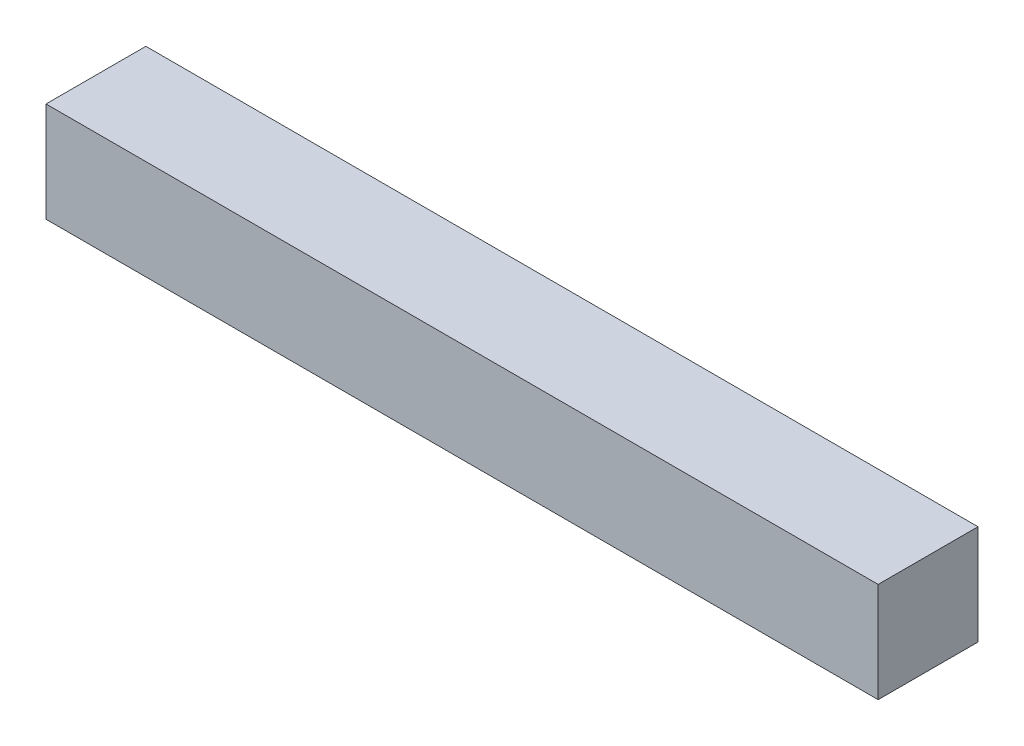
ISO-10303-21;
HEADER;
FILE_DESCRIPTION(('STEP AP214'),'2;1');
FILE_NAME('part.step','',(''),(''),'','','');
FILE_SCHEMA(('AUTOMOTIVE_DESIGN { 1 0 10303 214 1 1 1 1 }'));
ENDSEC;
DATA;
#1=APPLICATION_CONTEXT('core data for automotive mechanical design processes');
#2=APPLICATION_PROTOCOL_DEFINITION('international standard','automotive_design',2000,#1);
#3=PRODUCT_CONTEXT('',#1,'mechanical');
#4=PRODUCT('Part','Part','',(#3));
#5=PRODUCT_RELATED_PRODUCT_CATEGORY('part','',(#4));
#6=PRODUCT_DEFINITION_FORMATION('','',#4);
#7=PRODUCT_DEFINITION_CONTEXT('part definition',#1,'design');
#8=PRODUCT_DEFINITION('design','',#6,#7);
#9=PRODUCT_DEFINITION_SHAPE('','',#8);
#10=(LENGTH_UNIT() NAMED_UNIT(*) SI_UNIT(.MILLI.,.METRE.));
#11=(NAMED_UNIT(*) PLANE_ANGLE_UNIT() SI_UNIT($,.RADIAN.));
#12=(NAMED_UNIT(*) SI_UNIT($,.STERADIAN.) SOLID_ANGLE_UNIT());
#13=UNCERTAINTY_MEASURE_WITH_UNIT(LENGTH_MEASURE(1.E-05),#10,'distance_accuracy_value','');
#14=(GEOMETRIC_REPRESENTATION_CONTEXT(3) GLOBAL_UNCERTAINTY_ASSIGNED_CONTEXT((#13)) GLOBAL_UNIT_ASSIGNED_CONTEXT((#10,
#11,#12)) REPRESENTATION_CONTEXT('',''));
#15=CARTESIAN_POINT('',(0.,0.,0.));
#16=DIRECTION('',(0.,0.,1.));
#17=DIRECTION('',(1.,0.,0.));
#18=AXIS2_PLACEMENT_3D('',#15,#16,#17);
#19=CARTESIAN_POINT('',(25.,6.,3.));
#20=DIRECTION('',(-1.,0.,0.));
#21=DIRECTION('',(0.,0.,1.));
#22=AXIS2_PLACEMENT_3D('',#19,#20,#21);
#23=PLANE('',#22);
#24=DIRECTION('',(0.,0.,-1.));
#25=VECTOR('',#24,1.);
#26=CARTESIAN_POINT('',(25.,0.,3.));
#27=LINE('',#26,#25);
#28=CARTESIAN_POINT('',(25.,0.,3.));
#29=VERTEX_POINT('',#28);
#30=CARTESIAN_POINT('',(25.,0.,-3.));
#31=VERTEX_POINT('',#30);
#32=EDGE_CURVE('E95',#29,#31,#27,.T.);
#33=ORIENTED_EDGE('',*,*,#32,.T.);
#34=DIRECTION('',(0.,-1.,0.));
#35=VECTOR('',#34,1.);
#36=CARTESIAN_POINT('',(25.,6.,-3.));
#37=LINE('',#36,#35);
#38=CARTESIAN_POINT('',(25.,6.,-3.));
#39=VERTEX_POINT('',#38);
#40=EDGE_CURVE('E11',#39,#31,#37,.T.);
#41=ORIENTED_EDGE('',*,*,#40,.F.);
#42=DIRECTION('',(0.,0.,-1.));
#43=VECTOR('',#42,1.);
#44=CARTESIAN_POINT('',(25.,6.,3.));
#45=LINE('',#44,#43);
#46=CARTESIAN_POINT('',(25.,6.,3.));
#47=VERTEX_POINT('',#46);
#48=EDGE_CURVE('E83',#47,#39,#45,.T.);
#49=ORIENTED_EDGE('',*,*,#48,.F.);
#50=DIRECTION('',(0.,-1.,0.));
#51=VECTOR('',#50,1.);
#52=CARTESIAN_POINT('',(25.,6.,3.));
#53=LINE('',#52,#51);
#54=EDGE_CURVE('E91',#47,#29,#53,.T.);
#55=ORIENTED_EDGE('',*,*,#54,.T.);
#56=EDGE_LOOP('',(#33,#41,#49,#55));
#57=FACE_BOUND('',#56,.T.);
#58=ADVANCED_FACE('F32',(#57),#23,.F.);
#59=CARTESIAN_POINT('',(-25.,6.,-3.));
#60=DIRECTION('',(0.,0.,1.));
#61=DIRECTION('',(1.,0.,0.));
#62=AXIS2_PLACEMENT_3D('',#59,#60,#61);
#63=PLANE('',#62);
#64=DIRECTION('',(-1.,0.,0.));
#65=VECTOR('',#64,1.);
#66=CARTESIAN_POINT('',(-25.,0.,-3.));
#67=LINE('',#66,#65);
#68=CARTESIAN_POINT('',(-25.,0.,-3.));
#69=VERTEX_POINT('',#68);
#70=EDGE_CURVE('E87',#31,#69,#67,.T.);
#71=ORIENTED_EDGE('',*,*,#70,.T.);
#72=DIRECTION('',(0.,-1.,0.));
#73=VECTOR('',#72,1.);
#74=CARTESIAN_POINT('',(-25.,6.,-3.));
#75=LINE('',#74,#73);
#76=CARTESIAN_POINT('',(-25.,6.,-3.));
#77=VERTEX_POINT('',#76);
#78=EDGE_CURVE('E40',#77,#69,#75,.T.);
#79=ORIENTED_EDGE('',*,*,#78,.F.);
#80=DIRECTION('',(-1.,0.,0.));
#81=VECTOR('',#80,1.);
#82=CARTESIAN_POINT('',(-25.,6.,-3.));
#83=LINE('',#82,#81);
#84=EDGE_CURVE('E78',#39,#77,#83,.T.);
#85=ORIENTED_EDGE('',*,*,#84,.F.);
#86=ORIENTED_EDGE('',*,*,#40,.T.);
#87=EDGE_LOOP('',(#71,#79,#85,#86));
#88=FACE_BOUND('',#87,.T.);
#89=ADVANCED_FACE('F86',(#88),#63,.F.);
#90=CARTESIAN_POINT('',(-25.,6.,3.));
#91=DIRECTION('',(1.,0.,0.));
#92=DIRECTION('',(0.,0.,-1.));
#93=AXIS2_PLACEMENT_3D('',#90,#91,#92);
#94=PLANE('',#93);
#95=DIRECTION('',(0.,0.,1.));
#96=VECTOR('',#95,1.);
#97=CARTESIAN_POINT('',(-25.,0.,3.));
#98=LINE('',#97,#96);
#99=CARTESIAN_POINT('',(-25.,0.,3.));
#100=VERTEX_POINT('',#99);
#101=EDGE_CURVE('E65',#69,#100,#98,.T.);
#102=ORIENTED_EDGE('',*,*,#101,.T.);
#103=DIRECTION('',(0.,-1.,0.));
#104=VECTOR('',#103,1.);
#105=CARTESIAN_POINT('',(-25.,6.,3.));
#106=LINE('',#105,#104);
#107=CARTESIAN_POINT('',(-25.,6.,3.));
#108=VERTEX_POINT('',#107);
#109=EDGE_CURVE('E88',#108,#100,#106,.T.);
#110=ORIENTED_EDGE('',*,*,#109,.F.);
#111=DIRECTION('',(0.,0.,1.));
#112=VECTOR('',#111,1.);
#113=CARTESIAN_POINT('',(-25.,6.,3.));
#114=LINE('',#113,#112);
#115=EDGE_CURVE('E81',#77,#108,#114,.T.);
#116=ORIENTED_EDGE('',*,*,#115,.F.);
#117=ORIENTED_EDGE('',*,*,#78,.T.);
#118=EDGE_LOOP('',(#102,#110,#116,#117));
#119=FACE_BOUND('',#118,.T.);
#120=ADVANCED_FACE('F89',(#119),#94,.F.);
#121=CARTESIAN_POINT('',(-25.,6.,3.));
#122=DIRECTION('',(0.,0.,-1.));
#123=DIRECTION('',(-1.,0.,0.));
#124=AXIS2_PLACEMENT_3D('',#121,#122,#123);
#125=PLANE('',#124);
#126=DIRECTION('',(1.,0.,0.));
#127=VECTOR('',#126,1.);
#128=CARTESIAN_POINT('',(-25.,0.,3.));
#129=LINE('',#128,#127);
#130=EDGE_CURVE('E71',#100,#29,#129,.T.);
#131=ORIENTED_EDGE('',*,*,#130,.T.);
#132=ORIENTED_EDGE('',*,*,#54,.F.);
#133=DIRECTION('',(1.,0.,0.));
#134=VECTOR('',#133,1.);
#135=CARTESIAN_POINT('',(-25.,6.,3.));
#136=LINE('',#135,#134);
#137=EDGE_CURVE('E48',#108,#47,#136,.T.);
#138=ORIENTED_EDGE('',*,*,#137,.F.);
#139=ORIENTED_EDGE('',*,*,#109,.T.);
#140=EDGE_LOOP('',(#131,#132,#138,#139));
#141=FACE_BOUND('',#140,.T.);
#142=ADVANCED_FACE('F102',(#141),#125,.F.);
#143=CARTESIAN_POINT('',(0.,6.,0.));
#144=DIRECTION('',(0.,-1.,0.));
#145=DIRECTION('',(0.,0.,-1.));
#146=AXIS2_PLACEMENT_3D('',#143,#144,#145);
#147=PLANE('',#146);
#148=ORIENTED_EDGE('',*,*,#48,.T.);
#149=ORIENTED_EDGE('',*,*,#84,.T.);
#150=ORIENTED_EDGE('',*,*,#115,.T.);
#151=ORIENTED_EDGE('',*,*,#137,.T.);
#152=EDGE_LOOP('',(#148,#149,#150,#151));
#153=FACE_BOUND('',#152,.T.);
#154=ADVANCED_FACE('F79',(#153),#147,.F.);
#155=CARTESIAN_POINT('',(0.,0.,0.));
#156=DIRECTION('',(0.,-1.,0.));
#157=DIRECTION('',(0.,0.,-1.));
#158=AXIS2_PLACEMENT_3D('',#155,#156,#157);
#159=PLANE('',#158);
#160=ORIENTED_EDGE('',*,*,#32,.F.);
#161=ORIENTED_EDGE('',*,*,#130,.F.);
#162=ORIENTED_EDGE('',*,*,#101,.F.);
#163=ORIENTED_EDGE('',*,*,#70,.F.);
#164=EDGE_LOOP('',(#160,#161,#162,#163));
#165=FACE_BOUND('',#164,.T.);
#166=ADVANCED_FACE('F105',(#165),#159,.T.);
#167=CLOSED_SHELL('',(#58,#89,#120,#142,#154,#166));
#168=MANIFOLD_SOLID_BREP('B2',#167);
#169=ADVANCED_BREP_SHAPE_REPRESENTATION('',(#18,#168),#14);
#170=SHAPE_DEFINITION_REPRESENTATION(#9,#169);
ENDSEC;
END-ISO-10303-21;
